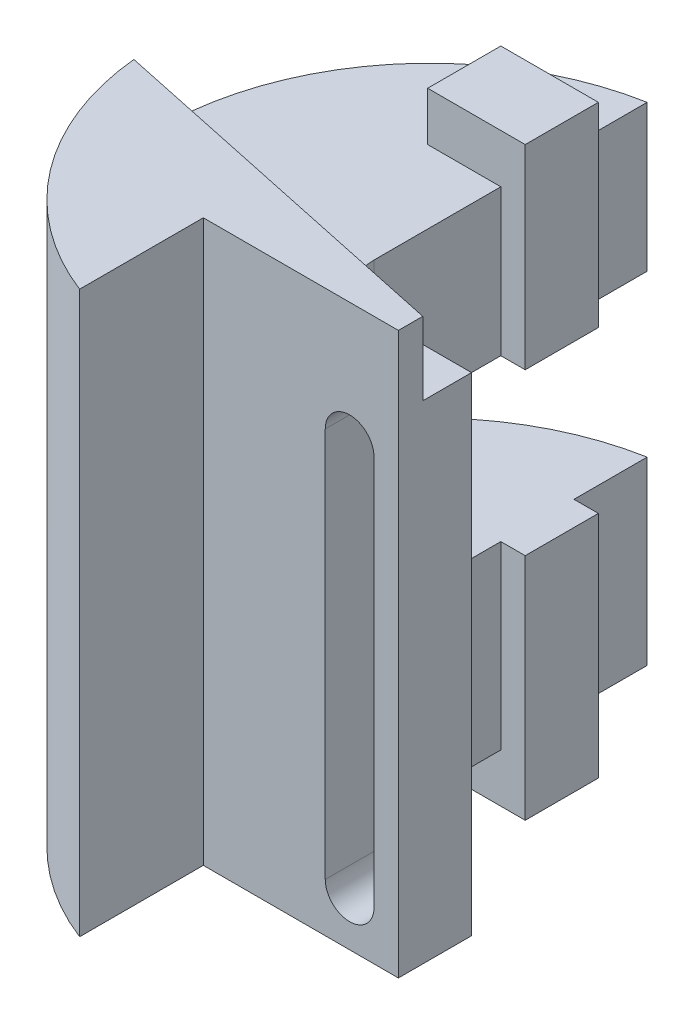
ISO-10303-21;
HEADER;
FILE_DESCRIPTION(('STEP AP214'),'2;1');
FILE_NAME('part.step','',(''),(''),'','','');
FILE_SCHEMA(('AUTOMOTIVE_DESIGN { 1 0 10303 214 1 1 1 1 }'));
ENDSEC;
DATA;
#1=APPLICATION_CONTEXT('core data for automotive mechanical design processes');
#2=APPLICATION_PROTOCOL_DEFINITION('international standard','automotive_design',2000,#1);
#3=PRODUCT_CONTEXT('',#1,'mechanical');
#4=PRODUCT('Part','Part','',(#3));
#5=PRODUCT_RELATED_PRODUCT_CATEGORY('part','',(#4));
#6=PRODUCT_DEFINITION_FORMATION('','',#4);
#7=PRODUCT_DEFINITION_CONTEXT('part definition',#1,'design');
#8=PRODUCT_DEFINITION('design','',#6,#7);
#9=PRODUCT_DEFINITION_SHAPE('','',#8);
#10=(LENGTH_UNIT() NAMED_UNIT(*) SI_UNIT(.MILLI.,.METRE.));
#11=(NAMED_UNIT(*) PLANE_ANGLE_UNIT() SI_UNIT($,.RADIAN.));
#12=(NAMED_UNIT(*) SI_UNIT($,.STERADIAN.) SOLID_ANGLE_UNIT());
#13=UNCERTAINTY_MEASURE_WITH_UNIT(LENGTH_MEASURE(1.E-05),#10,'distance_accuracy_value','');
#14=(GEOMETRIC_REPRESENTATION_CONTEXT(3) GLOBAL_UNCERTAINTY_ASSIGNED_CONTEXT((#13)) GLOBAL_UNIT_ASSIGNED_CONTEXT((#10,
#11,#12)) REPRESENTATION_CONTEXT('',''));
#15=CARTESIAN_POINT('',(0.,0.,0.));
#16=DIRECTION('',(0.,0.,1.));
#17=DIRECTION('',(1.,0.,0.));
#18=AXIS2_PLACEMENT_3D('',#15,#16,#17);
#19=CARTESIAN_POINT('',(-30.,115.,-25.));
#20=DIRECTION('',(-1.,0.,0.));
#21=DIRECTION('',(0.,0.,1.));
#22=AXIS2_PLACEMENT_3D('',#19,#20,#21);
#23=PLANE('',#22);
#24=DIRECTION('',(0.,-1.,0.));
#25=VECTOR('',#24,1.);
#26=CARTESIAN_POINT('',(-30.,115.,-81.));
#27=LINE('',#26,#25);
#28=CARTESIAN_POINT('',(-30.,37.,-81.));
#29=VERTEX_POINT('',#28);
#30=CARTESIAN_POINT('',(-30.,0.,-81.));
#31=VERTEX_POINT('',#30);
#32=EDGE_CURVE('E409',#29,#31,#27,.T.);
#33=ORIENTED_EDGE('',*,*,#32,.F.);
#34=DIRECTION('',(0.,0.,1.));
#35=VECTOR('',#34,1.);
#36=CARTESIAN_POINT('',(-30.,37.,-25.));
#37=LINE('',#36,#35);
#38=CARTESIAN_POINT('',(-30.,37.,-66.));
#39=VERTEX_POINT('',#38);
#40=EDGE_CURVE('E283',#29,#39,#37,.T.);
#41=ORIENTED_EDGE('',*,*,#40,.T.);
#42=DIRECTION('',(0.,1.,0.));
#43=VECTOR('',#42,1.);
#44=CARTESIAN_POINT('',(-30.,115.,-66.));
#45=LINE('',#44,#43);
#46=CARTESIAN_POINT('',(-30.,0.,-66.));
#47=VERTEX_POINT('',#46);
#48=EDGE_CURVE('E333',#47,#39,#45,.T.);
#49=ORIENTED_EDGE('',*,*,#48,.F.);
#50=DIRECTION('',(0.,0.,-1.));
#51=VECTOR('',#50,1.);
#52=CARTESIAN_POINT('',(-30.,0.,-25.));
#53=LINE('',#52,#51);
#54=EDGE_CURVE('E392',#47,#31,#53,.T.);
#55=ORIENTED_EDGE('',*,*,#54,.T.);
#56=EDGE_LOOP('',(#33,#41,#49,#55));
#57=FACE_BOUND('',#56,.T.);
#58=ADVANCED_FACE('F43',(#57),#23,.F.);
#59=CARTESIAN_POINT('',(-45.,110.,-51.));
#60=DIRECTION('',(0.,0.,-1.));
#61=DIRECTION('',(-1.,0.,0.));
#62=AXIS2_PLACEMENT_3D('',#59,#60,#61);
#63=PLANE('',#62);
#64=DIRECTION('',(0.,-1.,0.));
#65=VECTOR('',#64,1.);
#66=CARTESIAN_POINT('',(-25.,110.,-51.));
#67=LINE('',#66,#65);
#68=CARTESIAN_POINT('',(-25.,37.,-51.));
#69=VERTEX_POINT('',#68);
#70=CARTESIAN_POINT('',(-25.,-9.99999999999999,-51.));
#71=VERTEX_POINT('',#70);
#72=EDGE_CURVE('E324',#69,#71,#67,.T.);
#73=ORIENTED_EDGE('',*,*,#72,.F.);
#74=DIRECTION('',(-1.,0.,0.));
#75=VECTOR('',#74,1.);
#76=CARTESIAN_POINT('',(-45.,37.,-51.));
#77=LINE('',#76,#75);
#78=CARTESIAN_POINT('',(-30.,37.,-51.));
#79=VERTEX_POINT('',#78);
#80=EDGE_CURVE('E280',#69,#79,#77,.T.);
#81=ORIENTED_EDGE('',*,*,#80,.T.);
#82=DIRECTION('',(0.,-1.,0.));
#83=VECTOR('',#82,1.);
#84=CARTESIAN_POINT('',(-30.,115.,-51.));
#85=LINE('',#84,#83);
#86=CARTESIAN_POINT('',(-30.,0.,-51.));
#87=VERTEX_POINT('',#86);
#88=EDGE_CURVE('E339',#79,#87,#85,.T.);
#89=ORIENTED_EDGE('',*,*,#88,.T.);
#90=DIRECTION('',(1.,0.,0.));
#91=VECTOR('',#90,1.);
#92=CARTESIAN_POINT('',(-20.,0.,-51.));
#93=LINE('',#92,#91);
#94=CARTESIAN_POINT('',(-45.,0.,-51.));
#95=VERTEX_POINT('',#94);
#96=EDGE_CURVE('E343',#95,#87,#93,.T.);
#97=ORIENTED_EDGE('',*,*,#96,.F.);
#98=DIRECTION('',(0.,-1.,0.));
#99=VECTOR('',#98,1.);
#100=CARTESIAN_POINT('',(-45.,110.,-51.));
#101=LINE('',#100,#99);
#102=CARTESIAN_POINT('',(-45.,-9.99999999999999,-51.));
#103=VERTEX_POINT('',#102);
#104=EDGE_CURVE('E328',#95,#103,#101,.T.);
#105=ORIENTED_EDGE('',*,*,#104,.T.);
#106=DIRECTION('',(1.,0.,0.));
#107=VECTOR('',#106,1.);
#108=CARTESIAN_POINT('',(-45.,-9.99999999999999,-51.));
#109=LINE('',#108,#107);
#110=EDGE_CURVE('E298',#103,#71,#109,.T.);
#111=ORIENTED_EDGE('',*,*,#110,.T.);
#112=EDGE_LOOP('',(#73,#81,#89,#97,#105,#111));
#113=FACE_BOUND('',#112,.T.);
#114=ADVANCED_FACE('F462',(#113),#63,.F.);
#115=CARTESIAN_POINT('',(-25.,110.,-66.));
#116=DIRECTION('',(-1.,0.,0.));
#117=DIRECTION('',(0.,0.,1.));
#118=AXIS2_PLACEMENT_3D('',#115,#116,#117);
#119=PLANE('',#118);
#120=DIRECTION('',(0.,-1.,0.));
#121=VECTOR('',#120,1.);
#122=CARTESIAN_POINT('',(-25.,110.,-66.));
#123=LINE('',#122,#121);
#124=CARTESIAN_POINT('',(-25.,37.,-66.));
#125=VERTEX_POINT('',#124);
#126=CARTESIAN_POINT('',(-25.,-9.99999999999999,-66.));
#127=VERTEX_POINT('',#126);
#128=EDGE_CURVE('E320',#125,#127,#123,.T.);
#129=ORIENTED_EDGE('',*,*,#128,.F.);
#130=DIRECTION('',(0.,0.,1.));
#131=VECTOR('',#130,1.);
#132=CARTESIAN_POINT('',(-25.,37.,-66.));
#133=LINE('',#132,#131);
#134=EDGE_CURVE('E277',#125,#69,#133,.T.);
#135=ORIENTED_EDGE('',*,*,#134,.T.);
#136=ORIENTED_EDGE('',*,*,#72,.T.);
#137=DIRECTION('',(0.,0.,-1.));
#138=VECTOR('',#137,1.);
#139=CARTESIAN_POINT('',(-25.,-9.99999999999999,-66.));
#140=LINE('',#139,#138);
#141=EDGE_CURVE('E301',#71,#127,#140,.T.);
#142=ORIENTED_EDGE('',*,*,#141,.T.);
#143=EDGE_LOOP('',(#129,#135,#136,#142));
#144=FACE_BOUND('',#143,.T.);
#145=ADVANCED_FACE('F471',(#144),#119,.F.);
#146=CARTESIAN_POINT('',(-45.,110.,-66.));
#147=DIRECTION('',(0.,0.,1.));
#148=DIRECTION('',(1.,0.,0.));
#149=AXIS2_PLACEMENT_3D('',#146,#147,#148);
#150=PLANE('',#149);
#151=ORIENTED_EDGE('',*,*,#48,.T.);
#152=DIRECTION('',(1.,0.,0.));
#153=VECTOR('',#152,1.);
#154=CARTESIAN_POINT('',(-45.,37.,-66.));
#155=LINE('',#154,#153);
#156=EDGE_CURVE('E431',#39,#125,#155,.T.);
#157=ORIENTED_EDGE('',*,*,#156,.T.);
#158=ORIENTED_EDGE('',*,*,#128,.T.);
#159=DIRECTION('',(-1.,0.,0.));
#160=VECTOR('',#159,1.);
#161=CARTESIAN_POINT('',(-45.,-9.99999999999999,-66.));
#162=LINE('',#161,#160);
#163=CARTESIAN_POINT('',(-45.,-9.99999999999999,-66.));
#164=VERTEX_POINT('',#163);
#165=EDGE_CURVE('E304',#127,#164,#162,.T.);
#166=ORIENTED_EDGE('',*,*,#165,.T.);
#167=DIRECTION('',(0.,-1.,0.));
#168=VECTOR('',#167,1.);
#169=CARTESIAN_POINT('',(-45.,110.,-66.));
#170=LINE('',#169,#168);
#171=CARTESIAN_POINT('',(-45.,0.,-66.));
#172=VERTEX_POINT('',#171);
#173=EDGE_CURVE('E316',#172,#164,#170,.T.);
#174=ORIENTED_EDGE('',*,*,#173,.F.);
#175=DIRECTION('',(-1.,0.,0.));
#176=VECTOR('',#175,1.);
#177=CARTESIAN_POINT('',(-20.,0.,-66.));
#178=LINE('',#177,#176);
#179=EDGE_CURVE('E336',#47,#172,#178,.T.);
#180=ORIENTED_EDGE('',*,*,#179,.F.);
#181=EDGE_LOOP('',(#151,#157,#158,#166,#174,#180));
#182=FACE_BOUND('',#181,.T.);
#183=ADVANCED_FACE('F482',(#182),#150,.F.);
#184=ORIENTED_EDGE('',*,*,#88,.F.);
#185=DIRECTION('',(0.,0.,1.));
#186=VECTOR('',#185,1.);
#187=CARTESIAN_POINT('',(-30.,37.,-25.));
#188=LINE('',#187,#186);
#189=CARTESIAN_POINT('',(-30.,37.,-41.));
#190=VERTEX_POINT('',#189);
#191=EDGE_CURVE('E286',#79,#190,#188,.T.);
#192=ORIENTED_EDGE('',*,*,#191,.T.);
#193=DIRECTION('',(0.,1.,0.));
#194=VECTOR('',#193,1.);
#195=CARTESIAN_POINT('',(-30.,115.,-41.));
#196=LINE('',#195,#194);
#197=CARTESIAN_POINT('',(-30.,70.,-41.));
#198=VERTEX_POINT('',#197);
#199=EDGE_CURVE('E292',#190,#198,#196,.T.);
#200=ORIENTED_EDGE('',*,*,#199,.T.);
#201=DIRECTION('',(0.,0.,-1.));
#202=VECTOR('',#201,1.);
#203=CARTESIAN_POINT('',(-30.,70.,-25.));
#204=LINE('',#203,#202);
#205=CARTESIAN_POINT('',(-30.,70.,-51.));
#206=VERTEX_POINT('',#205);
#207=EDGE_CURVE('E271',#198,#206,#204,.T.);
#208=ORIENTED_EDGE('',*,*,#207,.T.);
#209=CARTESIAN_POINT('',(-30.,100.,-51.));
#210=VERTEX_POINT('',#209);
#211=EDGE_CURVE('E340',#210,#206,#85,.T.);
#212=ORIENTED_EDGE('',*,*,#211,.F.);
#213=DIRECTION('',(0.,0.,-1.));
#214=VECTOR('',#213,1.);
#215=CARTESIAN_POINT('',(-30.,100.,-25.));
#216=LINE('',#215,#214);
#217=CARTESIAN_POINT('',(-30.,100.,-25.));
#218=VERTEX_POINT('',#217);
#219=EDGE_CURVE('E355',#218,#210,#216,.T.);
#220=ORIENTED_EDGE('',*,*,#219,.F.);
#221=DIRECTION('',(0.,-1.,0.));
#222=VECTOR('',#221,1.);
#223=CARTESIAN_POINT('',(-30.,115.,-25.));
#224=LINE('',#223,#222);
#225=CARTESIAN_POINT('',(-30.,0.,-25.));
#226=VERTEX_POINT('',#225);
#227=EDGE_CURVE('E413',#218,#226,#224,.T.);
#228=ORIENTED_EDGE('',*,*,#227,.T.);
#229=EDGE_CURVE('E393',#226,#87,#53,.T.);
#230=ORIENTED_EDGE('',*,*,#229,.T.);
#231=EDGE_LOOP('',(#184,#192,#200,#208,#212,#220,#228,#230));
#232=FACE_BOUND('',#231,.T.);
#233=ADVANCED_FACE('F466',(#232),#23,.F.);
#234=CARTESIAN_POINT('',(-30.,70.,-66.));
#235=VERTEX_POINT('',#234);
#236=CARTESIAN_POINT('',(-30.,100.,-66.));
#237=VERTEX_POINT('',#236);
#238=EDGE_CURVE('E332',#235,#237,#45,.T.);
#239=ORIENTED_EDGE('',*,*,#238,.F.);
#240=DIRECTION('',(0.,0.,-1.));
#241=VECTOR('',#240,1.);
#242=CARTESIAN_POINT('',(-30.,70.,-25.));
#243=LINE('',#242,#241);
#244=CARTESIAN_POINT('',(-30.,70.,-81.));
#245=VERTEX_POINT('',#244);
#246=EDGE_CURVE('E268',#235,#245,#243,.T.);
#247=ORIENTED_EDGE('',*,*,#246,.T.);
#248=CARTESIAN_POINT('',(-30.,100.,-81.));
#249=VERTEX_POINT('',#248);
#250=EDGE_CURVE('E410',#249,#245,#27,.T.);
#251=ORIENTED_EDGE('',*,*,#250,.F.);
#252=EDGE_CURVE('E354',#237,#249,#216,.T.);
#253=ORIENTED_EDGE('',*,*,#252,.F.);
#254=EDGE_LOOP('',(#239,#247,#251,#253));
#255=FACE_BOUND('',#254,.T.);
#256=ADVANCED_FACE('F465',(#255),#23,.F.);
#257=CARTESIAN_POINT('',(-20.,0.,-25.));
#258=DIRECTION('',(0.,-1.,0.));
#259=DIRECTION('',(0.,0.,-1.));
#260=AXIS2_PLACEMENT_3D('',#257,#258,#259);
#261=PLANE('',#260);
#262=DIRECTION('',(0.,0.,1.));
#263=VECTOR('',#262,1.);
#264=CARTESIAN_POINT('',(-45.,0.,-25.));
#265=LINE('',#264,#263);
#266=EDGE_CURVE('E346',#172,#95,#265,.T.);
#267=ORIENTED_EDGE('',*,*,#266,.T.);
#268=ORIENTED_EDGE('',*,*,#96,.T.);
#269=ORIENTED_EDGE('',*,*,#229,.F.);
#270=CARTESIAN_POINT('',(-20.,0.,-25.));
#271=DIRECTION('',(0.,-1.,0.));
#272=DIRECTION('',(0.,0.,-1.));
#273=AXIS2_PLACEMENT_3D('',#270,#271,#272);
#274=CIRCLE('',#273,10.);
#275=CARTESIAN_POINT('',(-20.,0.,-15.));
#276=VERTEX_POINT('',#275);
#277=EDGE_CURVE('E389',#276,#226,#274,.T.);
#278=ORIENTED_EDGE('',*,*,#277,.F.);
#279=DIRECTION('',(-1.,0.,0.));
#280=VECTOR('',#279,1.);
#281=CARTESIAN_POINT('',(0.,0.,-15.));
#282=LINE('',#281,#280);
#283=CARTESIAN_POINT('',(0.,0.,-15.));
#284=VERTEX_POINT('',#283);
#285=EDGE_CURVE('E386',#284,#276,#282,.T.);
#286=ORIENTED_EDGE('',*,*,#285,.F.);
#287=DIRECTION('',(0.,0.,-1.));
#288=VECTOR('',#287,1.);
#289=CARTESIAN_POINT('',(0.,0.,0.));
#290=LINE('',#289,#288);
#291=CARTESIAN_POINT('',(0.,0.,0.));
#292=VERTEX_POINT('',#291);
#293=EDGE_CURVE('E371',#292,#284,#290,.T.);
#294=ORIENTED_EDGE('',*,*,#293,.F.);
#295=DIRECTION('',(1.,0.,0.));
#296=VECTOR('',#295,1.);
#297=CARTESIAN_POINT('',(0.,0.,0.));
#298=LINE('',#297,#296);
#299=CARTESIAN_POINT('',(-40.,0.,0.));
#300=VERTEX_POINT('',#299);
#301=EDGE_CURVE('E377',#300,#292,#298,.T.);
#302=ORIENTED_EDGE('',*,*,#301,.F.);
#303=DIRECTION('',(0.,0.,-1.));
#304=VECTOR('',#303,1.);
#305=CARTESIAN_POINT('',(-40.,0.,0.));
#306=LINE('',#305,#304);
#307=CARTESIAN_POINT('',(-40.,0.,25.3627969821569));
#308=VERTEX_POINT('',#307);
#309=EDGE_CURVE('E398',#308,#300,#306,.T.);
#310=ORIENTED_EDGE('',*,*,#309,.F.);
#311=CARTESIAN_POINT('',(-20.,0.,-26.4083339693685));
#312=DIRECTION('',(0.,1.,0.));
#313=DIRECTION('',(0.,0.,-1.));
#314=AXIS2_PLACEMENT_3D('',#311,#312,#313);
#315=CIRCLE('',#314,55.5);
#316=EDGE_CURVE('E396',#31,#308,#315,.T.);
#317=ORIENTED_EDGE('',*,*,#316,.F.);
#318=ORIENTED_EDGE('',*,*,#54,.F.);
#319=ORIENTED_EDGE('',*,*,#179,.T.);
#320=EDGE_LOOP('',(#267,#268,#269,#278,#286,#294,#302,#310,#317,#318,#319));
#321=FACE_BOUND('',#320,.T.);
#322=ADVANCED_FACE('F479',(#321),#261,.T.);
#323=CARTESIAN_POINT('',(-20.,100.,-25.));
#324=DIRECTION('',(0.,1.,0.));
#325=DIRECTION('',(0.,0.,1.));
#326=AXIS2_PLACEMENT_3D('',#323,#324,#325);
#327=PLANE('',#326);
#328=ORIENTED_EDGE('',*,*,#219,.T.);
#329=DIRECTION('',(-1.,0.,0.));
#330=VECTOR('',#329,1.);
#331=CARTESIAN_POINT('',(-20.,100.,-51.));
#332=LINE('',#331,#330);
#333=CARTESIAN_POINT('',(-45.,100.,-51.));
#334=VERTEX_POINT('',#333);
#335=EDGE_CURVE('E425',#210,#334,#332,.T.);
#336=ORIENTED_EDGE('',*,*,#335,.T.);
#337=DIRECTION('',(0.,0.,-1.));
#338=VECTOR('',#337,1.);
#339=CARTESIAN_POINT('',(-45.,100.,-25.));
#340=LINE('',#339,#338);
#341=CARTESIAN_POINT('',(-45.,100.,-66.));
#342=VERTEX_POINT('',#341);
#343=EDGE_CURVE('E422',#334,#342,#340,.T.);
#344=ORIENTED_EDGE('',*,*,#343,.T.);
#345=DIRECTION('',(1.,0.,0.));
#346=VECTOR('',#345,1.);
#347=CARTESIAN_POINT('',(-20.,100.,-66.));
#348=LINE('',#347,#346);
#349=EDGE_CURVE('E419',#342,#237,#348,.T.);
#350=ORIENTED_EDGE('',*,*,#349,.T.);
#351=ORIENTED_EDGE('',*,*,#252,.T.);
#352=CARTESIAN_POINT('',(-20.,100.,-26.4083339693685));
#353=DIRECTION('',(0.,1.,0.));
#354=DIRECTION('',(0.,0.,1.));
#355=AXIS2_PLACEMENT_3D('',#352,#353,#354);
#356=CIRCLE('',#355,55.5);
#357=CARTESIAN_POINT('',(-75.2350441418964,100.,-20.9917022998936));
#358=VERTEX_POINT('',#357);
#359=EDGE_CURVE('E358',#249,#358,#356,.T.);
#360=ORIENTED_EDGE('',*,*,#359,.T.);
#361=DIRECTION('',(0.978147600733806,0.,0.207911690817756));
#362=VECTOR('',#361,1.);
#363=CARTESIAN_POINT('',(0.,100.,-5.));
#364=LINE('',#363,#362);
#365=CARTESIAN_POINT('',(0.,100.,-5.));
#366=VERTEX_POINT('',#365);
#367=EDGE_CURVE('E361',#358,#366,#364,.T.);
#368=ORIENTED_EDGE('',*,*,#367,.T.);
#369=DIRECTION('',(0.,0.,-1.));
#370=VECTOR('',#369,1.);
#371=CARTESIAN_POINT('',(0.,100.,-5.));
#372=LINE('',#371,#370);
#373=CARTESIAN_POINT('',(0.,100.,-15.));
#374=VERTEX_POINT('',#373);
#375=EDGE_CURVE('E364',#366,#374,#372,.T.);
#376=ORIENTED_EDGE('',*,*,#375,.T.);
#377=DIRECTION('',(-1.,0.,0.));
#378=VECTOR('',#377,1.);
#379=CARTESIAN_POINT('',(0.,100.,-15.));
#380=LINE('',#379,#378);
#381=CARTESIAN_POINT('',(-20.,100.,-15.));
#382=VERTEX_POINT('',#381);
#383=EDGE_CURVE('E350',#374,#382,#380,.T.);
#384=ORIENTED_EDGE('',*,*,#383,.T.);
#385=CARTESIAN_POINT('',(-20.,100.,-25.));
#386=DIRECTION('',(0.,-1.,0.));
#387=DIRECTION('',(0.,0.,1.));
#388=AXIS2_PLACEMENT_3D('',#385,#386,#387);
#389=CIRCLE('',#388,10.);
#390=EDGE_CURVE('E352',#382,#218,#389,.T.);
#391=ORIENTED_EDGE('',*,*,#390,.T.);
#392=EDGE_LOOP('',(#328,#336,#344,#350,#351,#360,#368,#376,#384,#391));
#393=FACE_BOUND('',#392,.T.);
#394=ADVANCED_FACE('F534',(#393),#327,.T.);
#395=CARTESIAN_POINT('',(0.,115.,-15.));
#396=DIRECTION('',(0.,0.,1.));
#397=DIRECTION('',(1.,0.,0.));
#398=AXIS2_PLACEMENT_3D('',#395,#396,#397);
#399=PLANE('',#398);
#400=DIRECTION('',(0.,-1.,0.));
#401=VECTOR('',#400,1.);
#402=CARTESIAN_POINT('',(-4.99999999999999,90.,-15.));
#403=LINE('',#402,#401);
#404=CARTESIAN_POINT('',(-4.99999999999999,90.,-15.));
#405=VERTEX_POINT('',#404);
#406=CARTESIAN_POINT('',(-5.,10.,-15.));
#407=VERTEX_POINT('',#406);
#408=EDGE_CURVE('E240',#405,#407,#403,.T.);
#409=ORIENTED_EDGE('',*,*,#408,.F.);
#410=CARTESIAN_POINT('',(-9.99999999999999,90.,-15.));
#411=DIRECTION('',(0.,0.,-1.));
#412=DIRECTION('',(-1.,0.,0.));
#413=AXIS2_PLACEMENT_3D('',#410,#411,#412);
#414=CIRCLE('',#413,5.);
#415=CARTESIAN_POINT('',(-15.,90.,-15.));
#416=VERTEX_POINT('',#415);
#417=EDGE_CURVE('E58',#416,#405,#414,.T.);
#418=ORIENTED_EDGE('',*,*,#417,.F.);
#419=DIRECTION('',(0.,1.,0.));
#420=VECTOR('',#419,1.);
#421=CARTESIAN_POINT('',(-15.,90.,-15.));
#422=LINE('',#421,#420);
#423=CARTESIAN_POINT('',(-15.,10.,-15.));
#424=VERTEX_POINT('',#423);
#425=EDGE_CURVE('E247',#424,#416,#422,.T.);
#426=ORIENTED_EDGE('',*,*,#425,.F.);
#427=CARTESIAN_POINT('',(-10.,10.,-15.));
#428=DIRECTION('',(0.,0.,-1.));
#429=DIRECTION('',(-1.,0.,0.));
#430=AXIS2_PLACEMENT_3D('',#427,#428,#429);
#431=CIRCLE('',#430,5.);
#432=EDGE_CURVE('E231',#407,#424,#431,.T.);
#433=ORIENTED_EDGE('',*,*,#432,.F.);
#434=EDGE_LOOP('',(#409,#418,#426,#433));
#435=FACE_BOUND('',#434,.T.);
#436=ORIENTED_EDGE('',*,*,#383,.F.);
#437=DIRECTION('',(0.,-1.,0.));
#438=VECTOR('',#437,1.);
#439=CARTESIAN_POINT('',(0.,115.,-15.));
#440=LINE('',#439,#438);
#441=EDGE_CURVE('E417',#374,#284,#440,.T.);
#442=ORIENTED_EDGE('',*,*,#441,.T.);
#443=ORIENTED_EDGE('',*,*,#285,.T.);
#444=DIRECTION('',(0.,-1.,0.));
#445=VECTOR('',#444,1.);
#446=CARTESIAN_POINT('',(-20.,115.,-15.));
#447=LINE('',#446,#445);
#448=EDGE_CURVE('E415',#382,#276,#447,.T.);
#449=ORIENTED_EDGE('',*,*,#448,.F.);
#450=EDGE_LOOP('',(#436,#442,#443,#449));
#451=FACE_BOUND('',#450,.T.);
#452=ADVANCED_FACE('F244',(#435,#451),#399,.F.);
#453=CARTESIAN_POINT('',(-20.,115.,-25.));
#454=DIRECTION('',(0.,-1.,0.));
#455=DIRECTION('',(0.,0.,-1.));
#456=AXIS2_PLACEMENT_3D('',#453,#454,#455);
#457=CYLINDRICAL_SURFACE('',#456,10.);
#458=ORIENTED_EDGE('',*,*,#390,.F.);
#459=ORIENTED_EDGE('',*,*,#448,.T.);
#460=ORIENTED_EDGE('',*,*,#277,.T.);
#461=ORIENTED_EDGE('',*,*,#227,.F.);
#462=EDGE_LOOP('',(#458,#459,#460,#461));
#463=FACE_BOUND('',#462,.T.);
#464=ADVANCED_FACE('F549',(#463),#457,.F.);
#465=CARTESIAN_POINT('',(0.,115.,0.));
#466=DIRECTION('',(-1.,0.,0.));
#467=DIRECTION('',(0.,0.,1.));
#468=AXIS2_PLACEMENT_3D('',#465,#466,#467);
#469=PLANE('',#468);
#470=ORIENTED_EDGE('',*,*,#375,.F.);
#471=DIRECTION('',(0.,1.,0.));
#472=VECTOR('',#471,1.);
#473=CARTESIAN_POINT('',(0.,100.,-5.));
#474=LINE('',#473,#472);
#475=CARTESIAN_POINT('',(0.,115.,-5.));
#476=VERTEX_POINT('',#475);
#477=EDGE_CURVE('E368',#366,#476,#474,.T.);
#478=ORIENTED_EDGE('',*,*,#477,.T.);
#479=DIRECTION('',(0.,0.,-1.));
#480=VECTOR('',#479,1.);
#481=CARTESIAN_POINT('',(0.,115.,0.));
#482=LINE('',#481,#480);
#483=CARTESIAN_POINT('',(0.,115.,0.));
#484=VERTEX_POINT('',#483);
#485=EDGE_CURVE('E373',#484,#476,#482,.T.);
#486=ORIENTED_EDGE('',*,*,#485,.F.);
#487=DIRECTION('',(0.,-1.,0.));
#488=VECTOR('',#487,1.);
#489=CARTESIAN_POINT('',(0.,115.,0.));
#490=LINE('',#489,#488);
#491=EDGE_CURVE('E383',#484,#292,#490,.T.);
#492=ORIENTED_EDGE('',*,*,#491,.T.);
#493=ORIENTED_EDGE('',*,*,#293,.T.);
#494=ORIENTED_EDGE('',*,*,#441,.F.);
#495=EDGE_LOOP('',(#470,#478,#486,#492,#493,#494));
#496=FACE_BOUND('',#495,.T.);
#497=ADVANCED_FACE('F45',(#496),#469,.F.);
#498=CARTESIAN_POINT('',(-20.,115.,-26.4083339693685));
#499=DIRECTION('',(0.,-1.,0.));
#500=DIRECTION('',(0.,0.,-1.));
#501=AXIS2_PLACEMENT_3D('',#498,#499,#500);
#502=CYLINDRICAL_SURFACE('',#501,55.5);
#503=DIRECTION('',(0.,-1.,0.));
#504=VECTOR('',#503,1.);
#505=CARTESIAN_POINT('',(-73.5474862383895,115.,-41.));
#506=LINE('',#505,#504);
#507=CARTESIAN_POINT('',(-73.5474862383895,70.,-41.));
#508=VERTEX_POINT('',#507);
#509=CARTESIAN_POINT('',(-73.5474862383895,37.,-41.));
#510=VERTEX_POINT('',#509);
#511=EDGE_CURVE('E434',#508,#510,#506,.T.);
#512=ORIENTED_EDGE('',*,*,#511,.T.);
#513=CARTESIAN_POINT('',(-20.,37.,-26.4083339693685));
#514=DIRECTION('',(0.,-1.,0.));
#515=DIRECTION('',(0.,0.,-1.));
#516=AXIS2_PLACEMENT_3D('',#513,#514,#515);
#517=CIRCLE('',#516,55.5);
#518=EDGE_CURVE('E289',#510,#29,#517,.T.);
#519=ORIENTED_EDGE('',*,*,#518,.T.);
#520=ORIENTED_EDGE('',*,*,#32,.T.);
#521=ORIENTED_EDGE('',*,*,#316,.T.);
#522=DIRECTION('',(0.,-1.,0.));
#523=VECTOR('',#522,1.);
#524=CARTESIAN_POINT('',(-40.,115.,25.3627969821569));
#525=LINE('',#524,#523);
#526=CARTESIAN_POINT('',(-40.,115.,25.3627969821569));
#527=VERTEX_POINT('',#526);
#528=EDGE_CURVE('E406',#527,#308,#525,.T.);
#529=ORIENTED_EDGE('',*,*,#528,.F.);
#530=CARTESIAN_POINT('',(-20.,115.,-26.4083339693685));
#531=DIRECTION('',(0.,1.,0.));
#532=DIRECTION('',(0.,0.,-1.));
#533=AXIS2_PLACEMENT_3D('',#530,#531,#532);
#534=CIRCLE('',#533,55.5);
#535=CARTESIAN_POINT('',(-75.2350441418964,115.,-20.9917022998936));
#536=VERTEX_POINT('',#535);
#537=EDGE_CURVE('E376',#536,#527,#534,.T.);
#538=ORIENTED_EDGE('',*,*,#537,.F.);
#539=DIRECTION('',(0.,1.,0.));
#540=VECTOR('',#539,1.);
#541=CARTESIAN_POINT('',(-75.2350441418964,100.,-20.9917022998936));
#542=LINE('',#541,#540);
#543=EDGE_CURVE('E366',#358,#536,#542,.T.);
#544=ORIENTED_EDGE('',*,*,#543,.F.);
#545=ORIENTED_EDGE('',*,*,#359,.F.);
#546=ORIENTED_EDGE('',*,*,#250,.T.);
#547=CARTESIAN_POINT('',(-20.,70.,-26.4083339693685));
#548=DIRECTION('',(0.,1.,0.));
#549=DIRECTION('',(0.,0.,1.));
#550=AXIS2_PLACEMENT_3D('',#547,#548,#549);
#551=CIRCLE('',#550,55.5);
#552=EDGE_CURVE('E274',#245,#508,#551,.T.);
#553=ORIENTED_EDGE('',*,*,#552,.T.);
#554=EDGE_LOOP('',(#512,#519,#520,#521,#529,#538,#544,#545,#546,#553));
#555=FACE_BOUND('',#554,.T.);
#556=ADVANCED_FACE('F516',(#555),#502,.T.);
#557=CARTESIAN_POINT('',(-40.,115.,0.));
#558=DIRECTION('',(-1.,0.,0.));
#559=DIRECTION('',(0.,0.,1.));
#560=AXIS2_PLACEMENT_3D('',#557,#558,#559);
#561=PLANE('',#560);
#562=ORIENTED_EDGE('',*,*,#309,.T.);
#563=DIRECTION('',(0.,-1.,0.));
#564=VECTOR('',#563,1.);
#565=CARTESIAN_POINT('',(-40.,115.,0.));
#566=LINE('',#565,#564);
#567=CARTESIAN_POINT('',(-40.,115.,0.));
#568=VERTEX_POINT('',#567);
#569=EDGE_CURVE('E403',#568,#300,#566,.T.);
#570=ORIENTED_EDGE('',*,*,#569,.F.);
#571=DIRECTION('',(0.,0.,-1.));
#572=VECTOR('',#571,1.);
#573=CARTESIAN_POINT('',(-40.,115.,0.));
#574=LINE('',#573,#572);
#575=EDGE_CURVE('E379',#527,#568,#574,.T.);
#576=ORIENTED_EDGE('',*,*,#575,.F.);
#577=ORIENTED_EDGE('',*,*,#528,.T.);
#578=EDGE_LOOP('',(#562,#570,#576,#577));
#579=FACE_BOUND('',#578,.T.);
#580=ADVANCED_FACE('F520',(#579),#561,.F.);
#581=CARTESIAN_POINT('',(0.,115.,0.));
#582=DIRECTION('',(0.,0.,-1.));
#583=DIRECTION('',(-1.,0.,0.));
#584=AXIS2_PLACEMENT_3D('',#581,#582,#583);
#585=PLANE('',#584);
#586=DIRECTION('',(0.,1.,0.));
#587=VECTOR('',#586,1.);
#588=CARTESIAN_POINT('',(-15.,115.,0.));
#589=LINE('',#588,#587);
#590=CARTESIAN_POINT('',(-15.,10.,0.));
#591=VERTEX_POINT('',#590);
#592=CARTESIAN_POINT('',(-15.,90.,0.));
#593=VERTEX_POINT('',#592);
#594=EDGE_CURVE('E51',#591,#593,#589,.T.);
#595=ORIENTED_EDGE('',*,*,#594,.T.);
#596=CARTESIAN_POINT('',(-9.99999999999999,90.,0.));
#597=DIRECTION('',(0.,0.,-1.));
#598=DIRECTION('',(-1.,0.,0.));
#599=AXIS2_PLACEMENT_3D('',#596,#597,#598);
#600=CIRCLE('',#599,5.);
#601=CARTESIAN_POINT('',(-4.99999999999999,90.,0.));
#602=VERTEX_POINT('',#601);
#603=EDGE_CURVE('E11',#593,#602,#600,.T.);
#604=ORIENTED_EDGE('',*,*,#603,.T.);
#605=DIRECTION('',(0.,-1.,0.));
#606=VECTOR('',#605,1.);
#607=CARTESIAN_POINT('',(-4.99999999999999,115.,0.));
#608=LINE('',#607,#606);
#609=CARTESIAN_POINT('',(-5.,9.99999999999999,0.));
#610=VERTEX_POINT('',#609);
#611=EDGE_CURVE('E437',#602,#610,#608,.T.);
#612=ORIENTED_EDGE('',*,*,#611,.T.);
#613=CARTESIAN_POINT('',(-10.,10.,0.));
#614=DIRECTION('',(0.,0.,-1.));
#615=DIRECTION('',(-1.,0.,0.));
#616=AXIS2_PLACEMENT_3D('',#613,#614,#615);
#617=CIRCLE('',#616,5.);
#618=EDGE_CURVE('E234',#610,#591,#617,.T.);
#619=ORIENTED_EDGE('',*,*,#618,.T.);
#620=EDGE_LOOP('',(#595,#604,#612,#619));
#621=FACE_BOUND('',#620,.T.);
#622=ORIENTED_EDGE('',*,*,#301,.T.);
#623=ORIENTED_EDGE('',*,*,#491,.F.);
#624=DIRECTION('',(1.,0.,0.));
#625=VECTOR('',#624,1.);
#626=CARTESIAN_POINT('',(0.,115.,0.));
#627=LINE('',#626,#625);
#628=EDGE_CURVE('E381',#568,#484,#627,.T.);
#629=ORIENTED_EDGE('',*,*,#628,.F.);
#630=ORIENTED_EDGE('',*,*,#569,.T.);
#631=EDGE_LOOP('',(#622,#623,#629,#630));
#632=FACE_BOUND('',#631,.T.);
#633=ADVANCED_FACE('F441',(#621,#632),#585,.F.);
#634=CARTESIAN_POINT('',(-20.,115.,-25.));
#635=DIRECTION('',(0.,-1.,0.));
#636=DIRECTION('',(0.,0.,-1.));
#637=AXIS2_PLACEMENT_3D('',#634,#635,#636);
#638=PLANE('',#637);
#639=ORIENTED_EDGE('',*,*,#485,.T.);
#640=DIRECTION('',(0.978147600733806,0.,0.207911690817756));
#641=VECTOR('',#640,1.);
#642=CARTESIAN_POINT('',(0.,115.,-5.));
#643=LINE('',#642,#641);
#644=EDGE_CURVE('E349',#536,#476,#643,.T.);
#645=ORIENTED_EDGE('',*,*,#644,.F.);
#646=ORIENTED_EDGE('',*,*,#537,.T.);
#647=ORIENTED_EDGE('',*,*,#575,.T.);
#648=ORIENTED_EDGE('',*,*,#628,.T.);
#649=EDGE_LOOP('',(#639,#645,#646,#647,#648));
#650=FACE_BOUND('',#649,.T.);
#651=ADVANCED_FACE('F524',(#650),#638,.F.);
#652=CARTESIAN_POINT('',(0.,100.,-5.));
#653=DIRECTION('',(-0.207911690817756,0.,0.978147600733806));
#654=DIRECTION('',(0.978147600733806,0.,0.207911690817756));
#655=AXIS2_PLACEMENT_3D('',#652,#653,#654);
#656=PLANE('',#655);
#657=ORIENTED_EDGE('',*,*,#644,.T.);
#658=ORIENTED_EDGE('',*,*,#477,.F.);
#659=ORIENTED_EDGE('',*,*,#367,.F.);
#660=ORIENTED_EDGE('',*,*,#543,.T.);
#661=EDGE_LOOP('',(#657,#658,#659,#660));
#662=FACE_BOUND('',#661,.T.);
#663=ADVANCED_FACE('F531',(#662),#656,.F.);
#664=CARTESIAN_POINT('',(-45.,110.,-66.));
#665=DIRECTION('',(1.,0.,0.));
#666=DIRECTION('',(0.,0.,-1.));
#667=AXIS2_PLACEMENT_3D('',#664,#665,#666);
#668=PLANE('',#667);
#669=ORIENTED_EDGE('',*,*,#266,.F.);
#670=ORIENTED_EDGE('',*,*,#173,.T.);
#671=DIRECTION('',(0.,0.,1.));
#672=VECTOR('',#671,1.);
#673=CARTESIAN_POINT('',(-45.,-9.99999999999999,-66.));
#674=LINE('',#673,#672);
#675=EDGE_CURVE('E295',#164,#103,#674,.T.);
#676=ORIENTED_EDGE('',*,*,#675,.T.);
#677=ORIENTED_EDGE('',*,*,#104,.F.);
#678=EDGE_LOOP('',(#669,#670,#676,#677));
#679=FACE_BOUND('',#678,.T.);
#680=ADVANCED_FACE('F499',(#679),#668,.F.);
#681=ORIENTED_EDGE('',*,*,#343,.F.);
#682=CARTESIAN_POINT('',(-45.,110.,-51.));
#683=VERTEX_POINT('',#682);
#684=EDGE_CURVE('E329',#683,#334,#101,.T.);
#685=ORIENTED_EDGE('',*,*,#684,.F.);
#686=DIRECTION('',(0.,0.,1.));
#687=VECTOR('',#686,1.);
#688=CARTESIAN_POINT('',(-45.,110.,-66.));
#689=LINE('',#688,#687);
#690=CARTESIAN_POINT('',(-45.,110.,-66.));
#691=VERTEX_POINT('',#690);
#692=EDGE_CURVE('E307',#691,#683,#689,.T.);
#693=ORIENTED_EDGE('',*,*,#692,.F.);
#694=EDGE_CURVE('E317',#691,#342,#170,.T.);
#695=ORIENTED_EDGE('',*,*,#694,.T.);
#696=EDGE_LOOP('',(#681,#685,#693,#695));
#697=FACE_BOUND('',#696,.T.);
#698=ADVANCED_FACE('F585',(#697),#668,.F.);
#699=ORIENTED_EDGE('',*,*,#211,.T.);
#700=DIRECTION('',(1.,0.,0.));
#701=VECTOR('',#700,1.);
#702=CARTESIAN_POINT('',(-45.,70.,-51.));
#703=LINE('',#702,#701);
#704=CARTESIAN_POINT('',(-25.,70.,-51.));
#705=VERTEX_POINT('',#704);
#706=EDGE_CURVE('E265',#206,#705,#703,.T.);
#707=ORIENTED_EDGE('',*,*,#706,.T.);
#708=CARTESIAN_POINT('',(-25.,110.,-51.));
#709=VERTEX_POINT('',#708);
#710=EDGE_CURVE('E325',#709,#705,#67,.T.);
#711=ORIENTED_EDGE('',*,*,#710,.F.);
#712=DIRECTION('',(1.,0.,0.));
#713=VECTOR('',#712,1.);
#714=CARTESIAN_POINT('',(-45.,110.,-51.));
#715=LINE('',#714,#713);
#716=EDGE_CURVE('E310',#683,#709,#715,.T.);
#717=ORIENTED_EDGE('',*,*,#716,.F.);
#718=ORIENTED_EDGE('',*,*,#684,.T.);
#719=ORIENTED_EDGE('',*,*,#335,.F.);
#720=EDGE_LOOP('',(#699,#707,#711,#717,#718,#719));
#721=FACE_BOUND('',#720,.T.);
#722=ADVANCED_FACE('F474',(#721),#63,.F.);
#723=ORIENTED_EDGE('',*,*,#710,.T.);
#724=DIRECTION('',(0.,0.,-1.));
#725=VECTOR('',#724,1.);
#726=CARTESIAN_POINT('',(-25.,70.,-66.));
#727=LINE('',#726,#725);
#728=CARTESIAN_POINT('',(-25.,70.,-66.));
#729=VERTEX_POINT('',#728);
#730=EDGE_CURVE('E260',#705,#729,#727,.T.);
#731=ORIENTED_EDGE('',*,*,#730,.T.);
#732=CARTESIAN_POINT('',(-25.,110.,-66.));
#733=VERTEX_POINT('',#732);
#734=EDGE_CURVE('E321',#733,#729,#123,.T.);
#735=ORIENTED_EDGE('',*,*,#734,.F.);
#736=DIRECTION('',(0.,0.,-1.));
#737=VECTOR('',#736,1.);
#738=CARTESIAN_POINT('',(-25.,110.,-66.));
#739=LINE('',#738,#737);
#740=EDGE_CURVE('E312',#709,#733,#739,.T.);
#741=ORIENTED_EDGE('',*,*,#740,.F.);
#742=EDGE_LOOP('',(#723,#731,#735,#741));
#743=FACE_BOUND('',#742,.T.);
#744=ADVANCED_FACE('F596',(#743),#119,.F.);
#745=ORIENTED_EDGE('',*,*,#734,.T.);
#746=DIRECTION('',(-1.,0.,0.));
#747=VECTOR('',#746,1.);
#748=CARTESIAN_POINT('',(-45.,70.,-66.));
#749=LINE('',#748,#747);
#750=EDGE_CURVE('E428',#729,#235,#749,.T.);
#751=ORIENTED_EDGE('',*,*,#750,.T.);
#752=ORIENTED_EDGE('',*,*,#238,.T.);
#753=ORIENTED_EDGE('',*,*,#349,.F.);
#754=ORIENTED_EDGE('',*,*,#694,.F.);
#755=DIRECTION('',(-1.,0.,0.));
#756=VECTOR('',#755,1.);
#757=CARTESIAN_POINT('',(-45.,110.,-66.));
#758=LINE('',#757,#756);
#759=EDGE_CURVE('E314',#733,#691,#758,.T.);
#760=ORIENTED_EDGE('',*,*,#759,.F.);
#761=EDGE_LOOP('',(#745,#751,#752,#753,#754,#760));
#762=FACE_BOUND('',#761,.T.);
#763=ADVANCED_FACE('F489',(#762),#150,.F.);
#764=CARTESIAN_POINT('',(0.,110.,0.));
#765=DIRECTION('',(0.,1.,0.));
#766=DIRECTION('',(0.,0.,1.));
#767=AXIS2_PLACEMENT_3D('',#764,#765,#766);
#768=PLANE('',#767);
#769=ORIENTED_EDGE('',*,*,#692,.T.);
#770=ORIENTED_EDGE('',*,*,#716,.T.);
#771=ORIENTED_EDGE('',*,*,#740,.T.);
#772=ORIENTED_EDGE('',*,*,#759,.T.);
#773=EDGE_LOOP('',(#769,#770,#771,#772));
#774=FACE_BOUND('',#773,.T.);
#775=ADVANCED_FACE('F605',(#774),#768,.T.);
#776=CARTESIAN_POINT('',(0.,-9.99999999999999,0.));
#777=DIRECTION('',(0.,1.,0.));
#778=DIRECTION('',(0.,0.,1.));
#779=AXIS2_PLACEMENT_3D('',#776,#777,#778);
#780=PLANE('',#779);
#781=ORIENTED_EDGE('',*,*,#675,.F.);
#782=ORIENTED_EDGE('',*,*,#165,.F.);
#783=ORIENTED_EDGE('',*,*,#141,.F.);
#784=ORIENTED_EDGE('',*,*,#110,.F.);
#785=EDGE_LOOP('',(#781,#782,#783,#784));
#786=FACE_BOUND('',#785,.T.);
#787=ADVANCED_FACE('F506',(#786),#780,.F.);
#788=CARTESIAN_POINT('',(-75.5,70.,-41.));
#789=DIRECTION('',(0.,0.,1.));
#790=DIRECTION('',(1.,0.,0.));
#791=AXIS2_PLACEMENT_3D('',#788,#789,#790);
#792=PLANE('',#791);
#793=DIRECTION('',(1.,0.,0.));
#794=VECTOR('',#793,1.);
#795=CARTESIAN_POINT('',(-75.5,37.,-41.));
#796=LINE('',#795,#794);
#797=EDGE_CURVE('E257',#510,#190,#796,.T.);
#798=ORIENTED_EDGE('',*,*,#797,.F.);
#799=ORIENTED_EDGE('',*,*,#511,.F.);
#800=DIRECTION('',(1.,0.,0.));
#801=VECTOR('',#800,1.);
#802=CARTESIAN_POINT('',(-75.5,70.,-41.));
#803=LINE('',#802,#801);
#804=EDGE_CURVE('E254',#508,#198,#803,.T.);
#805=ORIENTED_EDGE('',*,*,#804,.T.);
#806=ORIENTED_EDGE('',*,*,#199,.F.);
#807=EDGE_LOOP('',(#798,#799,#805,#806));
#808=FACE_BOUND('',#807,.T.);
#809=ADVANCED_FACE('F540',(#808),#792,.F.);
#810=CARTESIAN_POINT('',(-75.5,37.,-81.));
#811=DIRECTION('',(0.,-1.,0.));
#812=DIRECTION('',(0.,0.,-1.));
#813=AXIS2_PLACEMENT_3D('',#810,#811,#812);
#814=PLANE('',#813);
#815=ORIENTED_EDGE('',*,*,#797,.T.);
#816=ORIENTED_EDGE('',*,*,#191,.F.);
#817=ORIENTED_EDGE('',*,*,#80,.F.);
#818=ORIENTED_EDGE('',*,*,#134,.F.);
#819=ORIENTED_EDGE('',*,*,#156,.F.);
#820=ORIENTED_EDGE('',*,*,#40,.F.);
#821=ORIENTED_EDGE('',*,*,#518,.F.);
#822=EDGE_LOOP('',(#815,#816,#817,#818,#819,#820,#821));
#823=FACE_BOUND('',#822,.T.);
#824=ADVANCED_FACE('F456',(#823),#814,.F.);
#825=CARTESIAN_POINT('',(-75.5,70.,-81.));
#826=DIRECTION('',(0.,1.,0.));
#827=DIRECTION('',(0.,0.,1.));
#828=AXIS2_PLACEMENT_3D('',#825,#826,#827);
#829=PLANE('',#828);
#830=ORIENTED_EDGE('',*,*,#246,.F.);
#831=ORIENTED_EDGE('',*,*,#750,.F.);
#832=ORIENTED_EDGE('',*,*,#730,.F.);
#833=ORIENTED_EDGE('',*,*,#706,.F.);
#834=ORIENTED_EDGE('',*,*,#207,.F.);
#835=ORIENTED_EDGE('',*,*,#804,.F.);
#836=ORIENTED_EDGE('',*,*,#552,.F.);
#837=EDGE_LOOP('',(#830,#831,#832,#833,#834,#835,#836));
#838=FACE_BOUND('',#837,.T.);
#839=ADVANCED_FACE('F448',(#838),#829,.F.);
#840=CARTESIAN_POINT('',(-9.99999999999999,90.,25.3627969821569));
#841=DIRECTION('',(0.,0.,-1.));
#842=DIRECTION('',(-1.,0.,0.));
#843=AXIS2_PLACEMENT_3D('',#840,#841,#842);
#844=CYLINDRICAL_SURFACE('',#843,5.);
#845=DIRECTION('',(0.,0.,-1.));
#846=VECTOR('',#845,1.);
#847=CARTESIAN_POINT('',(-15.,90.,25.3627969821569));
#848=LINE('',#847,#846);
#849=EDGE_CURVE('E252',#593,#416,#848,.T.);
#850=ORIENTED_EDGE('',*,*,#849,.T.);
#851=ORIENTED_EDGE('',*,*,#417,.T.);
#852=DIRECTION('',(0.,0.,-1.));
#853=VECTOR('',#852,1.);
#854=CARTESIAN_POINT('',(-4.99999999999999,90.,25.3627969821569));
#855=LINE('',#854,#853);
#856=EDGE_CURVE('E237',#602,#405,#855,.T.);
#857=ORIENTED_EDGE('',*,*,#856,.F.);
#858=ORIENTED_EDGE('',*,*,#603,.F.);
#859=EDGE_LOOP('',(#850,#851,#857,#858));
#860=FACE_BOUND('',#859,.T.);
#861=ADVANCED_FACE('F446',(#860),#844,.F.);
#862=CARTESIAN_POINT('',(-15.,90.,25.3627969821569));
#863=DIRECTION('',(-1.,0.,0.));
#864=DIRECTION('',(0.,-1.,0.));
#865=AXIS2_PLACEMENT_3D('',#862,#863,#864);
#866=PLANE('',#865);
#867=DIRECTION('',(0.,0.,-1.));
#868=VECTOR('',#867,1.);
#869=CARTESIAN_POINT('',(-15.,10.,25.3627969821569));
#870=LINE('',#869,#868);
#871=EDGE_CURVE('E236',#591,#424,#870,.T.);
#872=ORIENTED_EDGE('',*,*,#871,.T.);
#873=ORIENTED_EDGE('',*,*,#425,.T.);
#874=ORIENTED_EDGE('',*,*,#849,.F.);
#875=ORIENTED_EDGE('',*,*,#594,.F.);
#876=EDGE_LOOP('',(#872,#873,#874,#875));
#877=FACE_BOUND('',#876,.T.);
#878=ADVANCED_FACE('F445',(#877),#866,.F.);
#879=CARTESIAN_POINT('',(-10.,10.,25.3627969821569));
#880=DIRECTION('',(0.,0.,-1.));
#881=DIRECTION('',(-1.,0.,0.));
#882=AXIS2_PLACEMENT_3D('',#879,#880,#881);
#883=CYLINDRICAL_SURFACE('',#882,5.);
#884=DIRECTION('',(0.,0.,-1.));
#885=VECTOR('',#884,1.);
#886=CARTESIAN_POINT('',(-5.,10.,25.3627969821569));
#887=LINE('',#886,#885);
#888=EDGE_CURVE('E66',#610,#407,#887,.T.);
#889=ORIENTED_EDGE('',*,*,#888,.T.);
#890=ORIENTED_EDGE('',*,*,#432,.T.);
#891=ORIENTED_EDGE('',*,*,#871,.F.);
#892=ORIENTED_EDGE('',*,*,#618,.F.);
#893=EDGE_LOOP('',(#889,#890,#891,#892));
#894=FACE_BOUND('',#893,.T.);
#895=ADVANCED_FACE('F228',(#894),#883,.F.);
#896=CARTESIAN_POINT('',(-4.99999999999999,90.,25.3627969821569));
#897=DIRECTION('',(1.,0.,0.));
#898=DIRECTION('',(0.,1.,0.));
#899=AXIS2_PLACEMENT_3D('',#896,#897,#898);
#900=PLANE('',#899);
#901=ORIENTED_EDGE('',*,*,#856,.T.);
#902=ORIENTED_EDGE('',*,*,#408,.T.);
#903=ORIENTED_EDGE('',*,*,#888,.F.);
#904=ORIENTED_EDGE('',*,*,#611,.F.);
#905=EDGE_LOOP('',(#901,#902,#903,#904));
#906=FACE_BOUND('',#905,.T.);
#907=ADVANCED_FACE('F241',(#906),#900,.F.);
#908=CLOSED_SHELL('',(#58,#114,#145,#183,#233,#256,#322,#394,#452,#464,#497,#556,#580,#633,#651,
#663,#680,#698,#722,#744,#763,#775,#787,#809,#824,#839,#861,#878,#895,#907));
#909=MANIFOLD_SOLID_BREP('B2',#908);
#910=ADVANCED_BREP_SHAPE_REPRESENTATION('',(#18,#909),#14);
#911=SHAPE_DEFINITION_REPRESENTATION(#9,#910);
ENDSEC;
END-ISO-10303-21;
